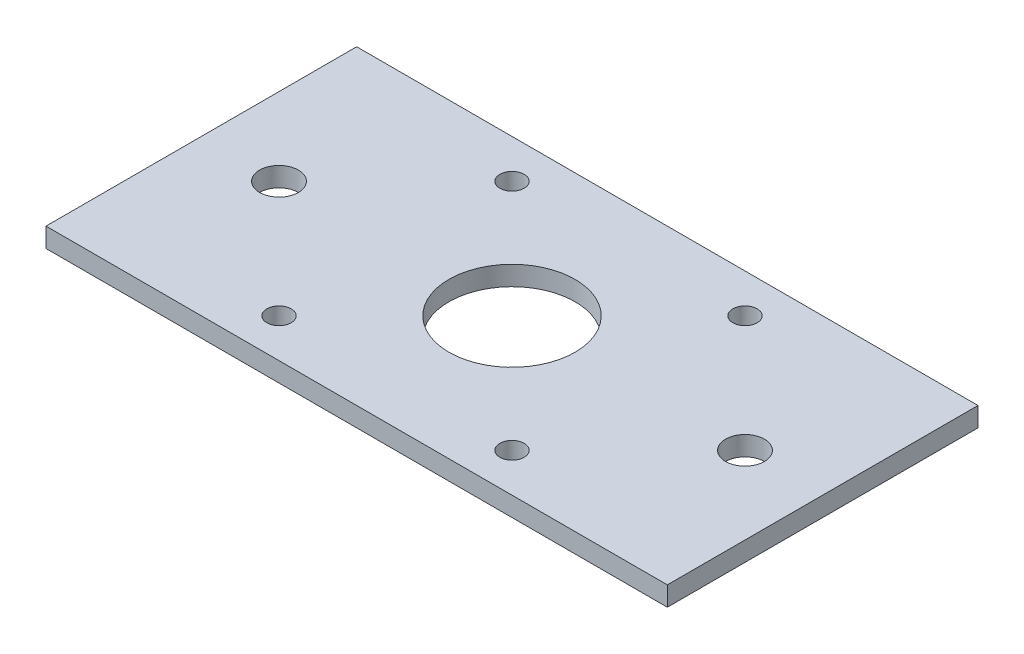
ISO-10303-21;
HEADER;
FILE_DESCRIPTION(('STEP AP214'),'2;1');
FILE_NAME('part.step','',(''),(''),'','','');
FILE_SCHEMA(('AUTOMOTIVE_DESIGN { 1 0 10303 214 1 1 1 1 }'));
ENDSEC;
DATA;
#1=APPLICATION_CONTEXT('core data for automotive mechanical design processes');
#2=APPLICATION_PROTOCOL_DEFINITION('international standard','automotive_design',2000,#1);
#3=PRODUCT_CONTEXT('',#1,'mechanical');
#4=PRODUCT('Part','Part','',(#3));
#5=PRODUCT_RELATED_PRODUCT_CATEGORY('part','',(#4));
#6=PRODUCT_DEFINITION_FORMATION('','',#4);
#7=PRODUCT_DEFINITION_CONTEXT('part definition',#1,'design');
#8=PRODUCT_DEFINITION('design','',#6,#7);
#9=PRODUCT_DEFINITION_SHAPE('','',#8);
#10=(LENGTH_UNIT() NAMED_UNIT(*) SI_UNIT(.MILLI.,.METRE.));
#11=(NAMED_UNIT(*) PLANE_ANGLE_UNIT() SI_UNIT($,.RADIAN.));
#12=(NAMED_UNIT(*) SI_UNIT($,.STERADIAN.) SOLID_ANGLE_UNIT());
#13=UNCERTAINTY_MEASURE_WITH_UNIT(LENGTH_MEASURE(1.E-05),#10,'distance_accuracy_value','');
#14=(GEOMETRIC_REPRESENTATION_CONTEXT(3) GLOBAL_UNCERTAINTY_ASSIGNED_CONTEXT((#13)) GLOBAL_UNIT_ASSIGNED_CONTEXT((#10,
#11,#12)) REPRESENTATION_CONTEXT('',''));
#15=CARTESIAN_POINT('',(0.,0.,0.));
#16=DIRECTION('',(0.,0.,1.));
#17=DIRECTION('',(1.,0.,0.));
#18=AXIS2_PLACEMENT_3D('',#15,#16,#17);
#19=CARTESIAN_POINT('',(-58.7828705983497,6.35,31.8524048705626));
#20=DIRECTION('',(1.,0.,0.));
#21=DIRECTION('',(0.,0.,-1.));
#22=AXIS2_PLACEMENT_3D('',#19,#20,#21);
#23=PLANE('',#22);
#24=DIRECTION('',(0.,0.,1.));
#25=VECTOR('',#24,1.);
#26=CARTESIAN_POINT('',(-58.7828705983497,0.,31.8524048705626));
#27=LINE('',#26,#25);
#28=CARTESIAN_POINT('',(-58.7828705983497,0.,-69.7475951294374));
#29=VERTEX_POINT('',#28);
#30=CARTESIAN_POINT('',(-58.7828705983497,0.,31.8524048705626));
#31=VERTEX_POINT('',#30);
#32=EDGE_CURVE('E98',#29,#31,#27,.T.);
#33=ORIENTED_EDGE('',*,*,#32,.T.);
#34=DIRECTION('',(0.,-1.,0.));
#35=VECTOR('',#34,1.);
#36=CARTESIAN_POINT('',(-58.7828705983497,6.35,31.8524048705626));
#37=LINE('',#36,#35);
#38=CARTESIAN_POINT('',(-58.7828705983497,6.35,31.8524048705626));
#39=VERTEX_POINT('',#38);
#40=EDGE_CURVE('E11',#39,#31,#37,.T.);
#41=ORIENTED_EDGE('',*,*,#40,.F.);
#42=DIRECTION('',(0.,0.,1.));
#43=VECTOR('',#42,1.);
#44=CARTESIAN_POINT('',(-58.7828705983497,6.35,31.8524048705626));
#45=LINE('',#44,#43);
#46=CARTESIAN_POINT('',(-58.7828705983497,6.35,-69.7475951294374));
#47=VERTEX_POINT('',#46);
#48=EDGE_CURVE('E86',#47,#39,#45,.T.);
#49=ORIENTED_EDGE('',*,*,#48,.F.);
#50=DIRECTION('',(0.,-1.,0.));
#51=VECTOR('',#50,1.);
#52=CARTESIAN_POINT('',(-58.7828705983497,6.35,-69.7475951294374));
#53=LINE('',#52,#51);
#54=EDGE_CURVE('E94',#47,#29,#53,.T.);
#55=ORIENTED_EDGE('',*,*,#54,.T.);
#56=EDGE_LOOP('',(#33,#41,#49,#55));
#57=FACE_BOUND('',#56,.T.);
#58=ADVANCED_FACE('F35',(#57),#23,.F.);
#59=CARTESIAN_POINT('',(-58.7828705983497,6.35,31.8524048705626));
#60=DIRECTION('',(0.,0.,-1.));
#61=DIRECTION('',(-1.,0.,0.));
#62=AXIS2_PLACEMENT_3D('',#59,#60,#61);
#63=PLANE('',#62);
#64=DIRECTION('',(1.,0.,0.));
#65=VECTOR('',#64,1.);
#66=CARTESIAN_POINT('',(-58.7828705983497,0.,31.8524048705626));
#67=LINE('',#66,#65);
#68=CARTESIAN_POINT('',(144.41712940165,0.,31.8524048705626));
#69=VERTEX_POINT('',#68);
#70=EDGE_CURVE('E90',#31,#69,#67,.T.);
#71=ORIENTED_EDGE('',*,*,#70,.T.);
#72=DIRECTION('',(0.,-1.,0.));
#73=VECTOR('',#72,1.);
#74=CARTESIAN_POINT('',(144.41712940165,6.35,31.8524048705626));
#75=LINE('',#74,#73);
#76=CARTESIAN_POINT('',(144.41712940165,6.35,31.8524048705626));
#77=VERTEX_POINT('',#76);
#78=EDGE_CURVE('E43',#77,#69,#75,.T.);
#79=ORIENTED_EDGE('',*,*,#78,.F.);
#80=DIRECTION('',(1.,0.,0.));
#81=VECTOR('',#80,1.);
#82=CARTESIAN_POINT('',(-58.7828705983497,6.35,31.8524048705626));
#83=LINE('',#82,#81);
#84=EDGE_CURVE('E81',#39,#77,#83,.T.);
#85=ORIENTED_EDGE('',*,*,#84,.F.);
#86=ORIENTED_EDGE('',*,*,#40,.T.);
#87=EDGE_LOOP('',(#71,#79,#85,#86));
#88=FACE_BOUND('',#87,.T.);
#89=ADVANCED_FACE('F89',(#88),#63,.F.);
#90=CARTESIAN_POINT('',(144.41712940165,6.35,31.8524048705626));
#91=DIRECTION('',(-1.,0.,0.));
#92=DIRECTION('',(0.,0.,1.));
#93=AXIS2_PLACEMENT_3D('',#90,#91,#92);
#94=PLANE('',#93);
#95=DIRECTION('',(0.,0.,-1.));
#96=VECTOR('',#95,1.);
#97=CARTESIAN_POINT('',(144.41712940165,0.,31.8524048705626));
#98=LINE('',#97,#96);
#99=CARTESIAN_POINT('',(144.41712940165,0.,-69.7475951294374));
#100=VERTEX_POINT('',#99);
#101=EDGE_CURVE('E68',#69,#100,#98,.T.);
#102=ORIENTED_EDGE('',*,*,#101,.T.);
#103=DIRECTION('',(0.,-1.,0.));
#104=VECTOR('',#103,1.);
#105=CARTESIAN_POINT('',(144.41712940165,6.35,-69.7475951294374));
#106=LINE('',#105,#104);
#107=CARTESIAN_POINT('',(144.41712940165,6.35,-69.7475951294374));
#108=VERTEX_POINT('',#107);
#109=EDGE_CURVE('E91',#108,#100,#106,.T.);
#110=ORIENTED_EDGE('',*,*,#109,.F.);
#111=DIRECTION('',(0.,0.,-1.));
#112=VECTOR('',#111,1.);
#113=CARTESIAN_POINT('',(144.41712940165,6.35,31.8524048705626));
#114=LINE('',#113,#112);
#115=EDGE_CURVE('E84',#77,#108,#114,.T.);
#116=ORIENTED_EDGE('',*,*,#115,.F.);
#117=ORIENTED_EDGE('',*,*,#78,.T.);
#118=EDGE_LOOP('',(#102,#110,#116,#117));
#119=FACE_BOUND('',#118,.T.);
#120=ADVANCED_FACE('F92',(#119),#94,.F.);
#121=CARTESIAN_POINT('',(-58.7828705983497,6.35,-69.7475951294374));
#122=DIRECTION('',(0.,0.,1.));
#123=DIRECTION('',(1.,0.,0.));
#124=AXIS2_PLACEMENT_3D('',#121,#122,#123);
#125=PLANE('',#124);
#126=DIRECTION('',(-1.,0.,0.));
#127=VECTOR('',#126,1.);
#128=CARTESIAN_POINT('',(-58.7828705983497,0.,-69.7475951294374));
#129=LINE('',#128,#127);
#130=EDGE_CURVE('E74',#100,#29,#129,.T.);
#131=ORIENTED_EDGE('',*,*,#130,.T.);
#132=ORIENTED_EDGE('',*,*,#54,.F.);
#133=DIRECTION('',(-1.,0.,0.));
#134=VECTOR('',#133,1.);
#135=CARTESIAN_POINT('',(-58.7828705983497,6.35,-69.7475951294374));
#136=LINE('',#135,#134);
#137=EDGE_CURVE('E51',#108,#47,#136,.T.);
#138=ORIENTED_EDGE('',*,*,#137,.F.);
#139=ORIENTED_EDGE('',*,*,#109,.T.);
#140=EDGE_LOOP('',(#131,#132,#138,#139));
#141=FACE_BOUND('',#140,.T.);
#142=ADVANCED_FACE('F106',(#141),#125,.F.);
#143=CARTESIAN_POINT('',(0.,6.35,0.));
#144=DIRECTION('',(0.,-1.,0.));
#145=DIRECTION('',(0.,0.,-1.));
#146=AXIS2_PLACEMENT_3D('',#143,#144,#145);
#147=PLANE('',#146);
#148=CARTESIAN_POINT('',(4.71712940165026,6.35,-57.0475951294374));
#149=DIRECTION('',(0.,1.,0.));
#150=DIRECTION('',(0.,0.,1.));
#151=AXIS2_PLACEMENT_3D('',#148,#149,#150);
#152=CIRCLE('',#151,3.96875);
#153=CARTESIAN_POINT('',(4.71712940165026,6.35,-53.0788451294374));
#154=VERTEX_POINT('',#153);
#155=EDGE_CURVE('E150',#154,#154,#152,.T.);
#156=ORIENTED_EDGE('',*,*,#155,.F.);
#157=EDGE_LOOP('',(#156));
#158=FACE_BOUND('',#157,.T.);
#159=CARTESIAN_POINT('',(80.9171294016503,6.35,-57.0475951294374));
#160=DIRECTION('',(0.,1.,0.));
#161=DIRECTION('',(0.,0.,1.));
#162=AXIS2_PLACEMENT_3D('',#159,#160,#161);
#163=CIRCLE('',#162,3.96874999999999);
#164=CARTESIAN_POINT('',(80.9171294016503,6.35,-53.0788451294374));
#165=VERTEX_POINT('',#164);
#166=EDGE_CURVE('E144',#165,#165,#163,.T.);
#167=ORIENTED_EDGE('',*,*,#166,.F.);
#168=EDGE_LOOP('',(#167));
#169=FACE_BOUND('',#168,.T.);
#170=CARTESIAN_POINT('',(80.9171294016503,6.35,19.1524048705626));
#171=DIRECTION('',(0.,1.,0.));
#172=DIRECTION('',(0.,0.,1.));
#173=AXIS2_PLACEMENT_3D('',#170,#171,#172);
#174=CIRCLE('',#173,3.96874999999999);
#175=CARTESIAN_POINT('',(80.9171294016503,6.35,23.1211548705626));
#176=VERTEX_POINT('',#175);
#177=EDGE_CURVE('E138',#176,#176,#174,.T.);
#178=ORIENTED_EDGE('',*,*,#177,.F.);
#179=EDGE_LOOP('',(#178));
#180=FACE_BOUND('',#179,.T.);
#181=CARTESIAN_POINT('',(4.71712940165026,6.35,19.1524048705626));
#182=DIRECTION('',(0.,1.,0.));
#183=DIRECTION('',(0.,0.,1.));
#184=AXIS2_PLACEMENT_3D('',#181,#182,#183);
#185=CIRCLE('',#184,3.96875);
#186=CARTESIAN_POINT('',(4.71712940165026,6.35,23.1211548705626));
#187=VERTEX_POINT('',#186);
#188=EDGE_CURVE('E132',#187,#187,#185,.T.);
#189=ORIENTED_EDGE('',*,*,#188,.F.);
#190=EDGE_LOOP('',(#189));
#191=FACE_BOUND('',#190,.T.);
#192=CARTESIAN_POINT('',(42.8171294016502,6.35,-18.9475951294374));
#193=DIRECTION('',(0.,1.,0.));
#194=DIRECTION('',(0.,0.,1.));
#195=AXIS2_PLACEMENT_3D('',#192,#193,#194);
#196=CIRCLE('',#195,20.6375);
#197=CARTESIAN_POINT('',(42.8171294016502,6.35,1.68990487056262));
#198=VERTEX_POINT('',#197);
#199=EDGE_CURVE('E124',#198,#198,#196,.T.);
#200=ORIENTED_EDGE('',*,*,#199,.F.);
#201=EDGE_LOOP('',(#200));
#202=FACE_BOUND('',#201,.T.);
#203=CARTESIAN_POINT('',(-33.3828705983498,6.35,-18.9475951294374));
#204=DIRECTION('',(0.,1.,0.));
#205=DIRECTION('',(0.,0.,1.));
#206=AXIS2_PLACEMENT_3D('',#203,#204,#205);
#207=CIRCLE('',#206,6.34999999999999);
#208=CARTESIAN_POINT('',(-33.3828705983498,6.35,-12.5975951294374));
#209=VERTEX_POINT('',#208);
#210=EDGE_CURVE('E120',#209,#209,#207,.T.);
#211=ORIENTED_EDGE('',*,*,#210,.F.);
#212=EDGE_LOOP('',(#211));
#213=FACE_BOUND('',#212,.T.);
#214=CARTESIAN_POINT('',(119.01712940165,6.35,-18.9475951294374));
#215=DIRECTION('',(0.,1.,0.));
#216=DIRECTION('',(0.,0.,1.));
#217=AXIS2_PLACEMENT_3D('',#214,#215,#216);
#218=CIRCLE('',#217,6.34999999999998);
#219=CARTESIAN_POINT('',(119.01712940165,6.35,-12.5975951294374));
#220=VERTEX_POINT('',#219);
#221=EDGE_CURVE('E114',#220,#220,#218,.T.);
#222=ORIENTED_EDGE('',*,*,#221,.F.);
#223=EDGE_LOOP('',(#222));
#224=FACE_BOUND('',#223,.T.);
#225=ORIENTED_EDGE('',*,*,#48,.T.);
#226=ORIENTED_EDGE('',*,*,#84,.T.);
#227=ORIENTED_EDGE('',*,*,#115,.T.);
#228=ORIENTED_EDGE('',*,*,#137,.T.);
#229=EDGE_LOOP('',(#225,#226,#227,#228));
#230=FACE_BOUND('',#229,.T.);
#231=ADVANCED_FACE('F82',(#158,#169,#180,#191,#202,#213,#224,#230),#147,.F.);
#232=CARTESIAN_POINT('',(0.,0.,0.));
#233=DIRECTION('',(0.,-1.,0.));
#234=DIRECTION('',(0.,0.,-1.));
#235=AXIS2_PLACEMENT_3D('',#232,#233,#234);
#236=PLANE('',#235);
#237=CARTESIAN_POINT('',(4.71712940165026,0.,-57.0475951294374));
#238=DIRECTION('',(0.,-1.,0.));
#239=DIRECTION('',(0.,0.,-1.));
#240=AXIS2_PLACEMENT_3D('',#237,#238,#239);
#241=CIRCLE('',#240,3.96875);
#242=CARTESIAN_POINT('',(4.71712940165026,0.,-61.0163451294374));
#243=VERTEX_POINT('',#242);
#244=EDGE_CURVE('E147',#243,#243,#241,.T.);
#245=ORIENTED_EDGE('',*,*,#244,.F.);
#246=EDGE_LOOP('',(#245));
#247=FACE_BOUND('',#246,.T.);
#248=CARTESIAN_POINT('',(80.9171294016503,0.,-57.0475951294374));
#249=DIRECTION('',(0.,-1.,0.));
#250=DIRECTION('',(0.,0.,-1.));
#251=AXIS2_PLACEMENT_3D('',#248,#249,#250);
#252=CIRCLE('',#251,3.96874999999999);
#253=CARTESIAN_POINT('',(80.9171294016503,0.,-61.0163451294374));
#254=VERTEX_POINT('',#253);
#255=EDGE_CURVE('E141',#254,#254,#252,.T.);
#256=ORIENTED_EDGE('',*,*,#255,.F.);
#257=EDGE_LOOP('',(#256));
#258=FACE_BOUND('',#257,.T.);
#259=CARTESIAN_POINT('',(80.9171294016503,0.,19.1524048705626));
#260=DIRECTION('',(0.,-1.,0.));
#261=DIRECTION('',(0.,0.,-1.));
#262=AXIS2_PLACEMENT_3D('',#259,#260,#261);
#263=CIRCLE('',#262,3.96874999999999);
#264=CARTESIAN_POINT('',(80.9171294016503,0.,15.1836548705626));
#265=VERTEX_POINT('',#264);
#266=EDGE_CURVE('E135',#265,#265,#263,.T.);
#267=ORIENTED_EDGE('',*,*,#266,.F.);
#268=EDGE_LOOP('',(#267));
#269=FACE_BOUND('',#268,.T.);
#270=CARTESIAN_POINT('',(4.71712940165026,0.,19.1524048705626));
#271=DIRECTION('',(0.,-1.,0.));
#272=DIRECTION('',(0.,0.,-1.));
#273=AXIS2_PLACEMENT_3D('',#270,#271,#272);
#274=CIRCLE('',#273,3.96875);
#275=CARTESIAN_POINT('',(4.71712940165026,0.,15.1836548705626));
#276=VERTEX_POINT('',#275);
#277=EDGE_CURVE('E127',#276,#276,#274,.T.);
#278=ORIENTED_EDGE('',*,*,#277,.F.);
#279=EDGE_LOOP('',(#278));
#280=FACE_BOUND('',#279,.T.);
#281=CARTESIAN_POINT('',(42.8171294016502,0.,-18.9475951294374));
#282=DIRECTION('',(0.,1.,0.));
#283=DIRECTION('',(0.,0.,1.));
#284=AXIS2_PLACEMENT_3D('',#281,#282,#283);
#285=CIRCLE('',#284,20.6375);
#286=CARTESIAN_POINT('',(42.8171294016502,0.,1.68990487056262));
#287=VERTEX_POINT('',#286);
#288=EDGE_CURVE('E123',#287,#287,#285,.T.);
#289=ORIENTED_EDGE('',*,*,#288,.T.);
#290=EDGE_LOOP('',(#289));
#291=FACE_BOUND('',#290,.T.);
#292=CARTESIAN_POINT('',(-33.3828705983498,0.,-18.9475951294374));
#293=DIRECTION('',(0.,-1.,0.));
#294=DIRECTION('',(0.,0.,-1.));
#295=AXIS2_PLACEMENT_3D('',#292,#293,#294);
#296=CIRCLE('',#295,6.34999999999999);
#297=CARTESIAN_POINT('',(-33.3828705983498,0.,-25.2975951294374));
#298=VERTEX_POINT('',#297);
#299=EDGE_CURVE('E117',#298,#298,#296,.T.);
#300=ORIENTED_EDGE('',*,*,#299,.F.);
#301=EDGE_LOOP('',(#300));
#302=FACE_BOUND('',#301,.T.);
#303=CARTESIAN_POINT('',(119.01712940165,0.,-18.9475951294374));
#304=DIRECTION('',(0.,-1.,0.));
#305=DIRECTION('',(0.,0.,-1.));
#306=AXIS2_PLACEMENT_3D('',#303,#304,#305);
#307=CIRCLE('',#306,6.34999999999998);
#308=CARTESIAN_POINT('',(119.01712940165,0.,-25.2975951294374));
#309=VERTEX_POINT('',#308);
#310=EDGE_CURVE('E101',#309,#309,#307,.T.);
#311=ORIENTED_EDGE('',*,*,#310,.F.);
#312=EDGE_LOOP('',(#311));
#313=FACE_BOUND('',#312,.T.);
#314=ORIENTED_EDGE('',*,*,#32,.F.);
#315=ORIENTED_EDGE('',*,*,#130,.F.);
#316=ORIENTED_EDGE('',*,*,#101,.F.);
#317=ORIENTED_EDGE('',*,*,#70,.F.);
#318=EDGE_LOOP('',(#314,#315,#316,#317));
#319=FACE_BOUND('',#318,.T.);
#320=ADVANCED_FACE('F109',(#247,#258,#269,#280,#291,#302,#313,#319),#236,.T.);
#321=CARTESIAN_POINT('',(119.01712940165,6.35,-18.9475951294374));
#322=DIRECTION('',(0.,1.,0.));
#323=DIRECTION('',(0.,0.,1.));
#324=AXIS2_PLACEMENT_3D('',#321,#322,#323);
#325=CYLINDRICAL_SURFACE('',#324,6.34999999999998);
#326=ORIENTED_EDGE('',*,*,#310,.T.);
#327=EDGE_LOOP('',(#326));
#328=FACE_BOUND('',#327,.T.);
#329=ORIENTED_EDGE('',*,*,#221,.T.);
#330=EDGE_LOOP('',(#329));
#331=FACE_BOUND('',#330,.T.);
#332=ADVANCED_FACE('F171',(#328,#331),#325,.F.);
#333=CARTESIAN_POINT('',(-33.3828705983498,6.35,-18.9475951294374));
#334=DIRECTION('',(0.,1.,0.));
#335=DIRECTION('',(0.,0.,1.));
#336=AXIS2_PLACEMENT_3D('',#333,#334,#335);
#337=CYLINDRICAL_SURFACE('',#336,6.34999999999999);
#338=ORIENTED_EDGE('',*,*,#299,.T.);
#339=EDGE_LOOP('',(#338));
#340=FACE_BOUND('',#339,.T.);
#341=ORIENTED_EDGE('',*,*,#210,.T.);
#342=EDGE_LOOP('',(#341));
#343=FACE_BOUND('',#342,.T.);
#344=ADVANCED_FACE('F173',(#340,#343),#337,.F.);
#345=CARTESIAN_POINT('',(42.8171294016502,0.,-18.9475951294374));
#346=DIRECTION('',(0.,1.,0.));
#347=DIRECTION('',(0.,0.,1.));
#348=AXIS2_PLACEMENT_3D('',#345,#346,#347);
#349=CYLINDRICAL_SURFACE('',#348,20.6375);
#350=ORIENTED_EDGE('',*,*,#288,.F.);
#351=EDGE_LOOP('',(#350));
#352=FACE_BOUND('',#351,.T.);
#353=ORIENTED_EDGE('',*,*,#199,.T.);
#354=EDGE_LOOP('',(#353));
#355=FACE_BOUND('',#354,.T.);
#356=ADVANCED_FACE('F180',(#352,#355),#349,.F.);
#357=CARTESIAN_POINT('',(4.71712940165026,6.35,19.1524048705626));
#358=DIRECTION('',(0.,1.,0.));
#359=DIRECTION('',(0.,0.,1.));
#360=AXIS2_PLACEMENT_3D('',#357,#358,#359);
#361=CYLINDRICAL_SURFACE('',#360,3.96875);
#362=ORIENTED_EDGE('',*,*,#277,.T.);
#363=EDGE_LOOP('',(#362));
#364=FACE_BOUND('',#363,.T.);
#365=ORIENTED_EDGE('',*,*,#188,.T.);
#366=EDGE_LOOP('',(#365));
#367=FACE_BOUND('',#366,.T.);
#368=ADVANCED_FACE('F214',(#364,#367),#361,.F.);
#369=CARTESIAN_POINT('',(80.9171294016503,6.35,19.1524048705626));
#370=DIRECTION('',(0.,1.,0.));
#371=DIRECTION('',(0.,0.,1.));
#372=AXIS2_PLACEMENT_3D('',#369,#370,#371);
#373=CYLINDRICAL_SURFACE('',#372,3.96874999999999);
#374=ORIENTED_EDGE('',*,*,#266,.T.);
#375=EDGE_LOOP('',(#374));
#376=FACE_BOUND('',#375,.T.);
#377=ORIENTED_EDGE('',*,*,#177,.T.);
#378=EDGE_LOOP('',(#377));
#379=FACE_BOUND('',#378,.T.);
#380=ADVANCED_FACE('F220',(#376,#379),#373,.F.);
#381=CARTESIAN_POINT('',(80.9171294016503,6.35,-57.0475951294374));
#382=DIRECTION('',(0.,1.,0.));
#383=DIRECTION('',(0.,0.,1.));
#384=AXIS2_PLACEMENT_3D('',#381,#382,#383);
#385=CYLINDRICAL_SURFACE('',#384,3.96874999999999);
#386=ORIENTED_EDGE('',*,*,#255,.T.);
#387=EDGE_LOOP('',(#386));
#388=FACE_BOUND('',#387,.T.);
#389=ORIENTED_EDGE('',*,*,#166,.T.);
#390=EDGE_LOOP('',(#389));
#391=FACE_BOUND('',#390,.T.);
#392=ADVANCED_FACE('F232',(#388,#391),#385,.F.);
#393=CARTESIAN_POINT('',(4.71712940165026,6.35,-57.0475951294374));
#394=DIRECTION('',(0.,1.,0.));
#395=DIRECTION('',(0.,0.,1.));
#396=AXIS2_PLACEMENT_3D('',#393,#394,#395);
#397=CYLINDRICAL_SURFACE('',#396,3.96875);
#398=ORIENTED_EDGE('',*,*,#244,.T.);
#399=EDGE_LOOP('',(#398));
#400=FACE_BOUND('',#399,.T.);
#401=ORIENTED_EDGE('',*,*,#155,.T.);
#402=EDGE_LOOP('',(#401));
#403=FACE_BOUND('',#402,.T.);
#404=ADVANCED_FACE('F154',(#400,#403),#397,.F.);
#405=CLOSED_SHELL('',(#58,#89,#120,#142,#231,#320,#332,#344,#356,#368,#380,#392,#404));
#406=MANIFOLD_SOLID_BREP('B2',#405);
#407=ADVANCED_BREP_SHAPE_REPRESENTATION('',(#18,#406),#14);
#408=SHAPE_DEFINITION_REPRESENTATION(#9,#407);
ENDSEC;
END-ISO-10303-21;
